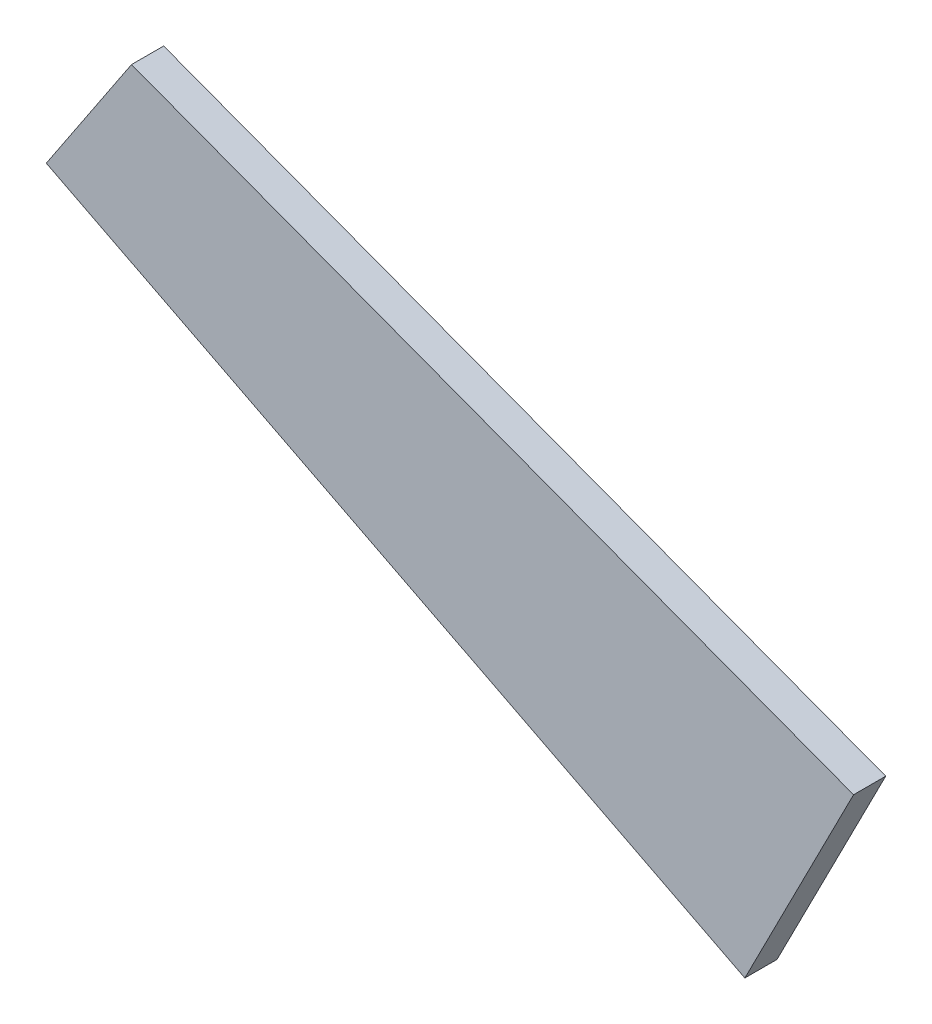
ISO-10303-21;
HEADER;
FILE_DESCRIPTION(('STEP AP214'),'2;1');
FILE_NAME('part.step','',(''),(''),'','','');
FILE_SCHEMA(('AUTOMOTIVE_DESIGN { 1 0 10303 214 1 1 1 1 }'));
ENDSEC;
DATA;
#1=APPLICATION_CONTEXT('core data for automotive mechanical design processes');
#2=APPLICATION_PROTOCOL_DEFINITION('international standard','automotive_design',2000,#1);
#3=PRODUCT_CONTEXT('',#1,'mechanical');
#4=PRODUCT('Part','Part','',(#3));
#5=PRODUCT_RELATED_PRODUCT_CATEGORY('part','',(#4));
#6=PRODUCT_DEFINITION_FORMATION('','',#4);
#7=PRODUCT_DEFINITION_CONTEXT('part definition',#1,'design');
#8=PRODUCT_DEFINITION('design','',#6,#7);
#9=PRODUCT_DEFINITION_SHAPE('','',#8);
#10=(LENGTH_UNIT() NAMED_UNIT(*) SI_UNIT(.MILLI.,.METRE.));
#11=(NAMED_UNIT(*) PLANE_ANGLE_UNIT() SI_UNIT($,.RADIAN.));
#12=(NAMED_UNIT(*) SI_UNIT($,.STERADIAN.) SOLID_ANGLE_UNIT());
#13=UNCERTAINTY_MEASURE_WITH_UNIT(LENGTH_MEASURE(1.E-05),#10,'distance_accuracy_value','');
#14=(GEOMETRIC_REPRESENTATION_CONTEXT(3) GLOBAL_UNCERTAINTY_ASSIGNED_CONTEXT((#13)) GLOBAL_UNIT_ASSIGNED_CONTEXT((#10,
#11,#12)) REPRESENTATION_CONTEXT('',''));
#15=CARTESIAN_POINT('',(0.,0.,0.));
#16=DIRECTION('',(0.,0.,1.));
#17=DIRECTION('',(1.,0.,0.));
#18=AXIS2_PLACEMENT_3D('',#15,#16,#17);
#19=CARTESIAN_POINT('',(316.89223359619,53.3320040135206,2.54));
#20=DIRECTION('',(-0.351768610150847,-0.936086985761762,0.));
#21=DIRECTION('',(0.936086985761762,-0.351768610150847,0.));
#22=AXIS2_PLACEMENT_3D('',#19,#20,#21);
#23=PLANE('',#22);
#24=DIRECTION('',(-0.936086985761762,0.351768610150847,0.));
#25=VECTOR('',#24,1.);
#26=CARTESIAN_POINT('',(316.89223359619,53.3320040135206,0.));
#27=LINE('',#26,#25);
#28=CARTESIAN_POINT('',(316.89223359619,53.3320040135206,0.));
#29=VERTEX_POINT('',#28);
#30=CARTESIAN_POINT('',(259.808460711214,74.783300479921,0.));
#31=VERTEX_POINT('',#30);
#32=EDGE_CURVE('E95',#29,#31,#27,.T.);
#33=ORIENTED_EDGE('',*,*,#32,.T.);
#34=DIRECTION('',(0.,0.,-1.));
#35=VECTOR('',#34,1.);
#36=CARTESIAN_POINT('',(259.808460711214,74.783300479921,2.54));
#37=LINE('',#36,#35);
#38=CARTESIAN_POINT('',(259.808460711214,74.783300479921,2.54));
#39=VERTEX_POINT('',#38);
#40=EDGE_CURVE('E11',#39,#31,#37,.T.);
#41=ORIENTED_EDGE('',*,*,#40,.F.);
#42=DIRECTION('',(-0.936086985761762,0.351768610150847,0.));
#43=VECTOR('',#42,1.);
#44=CARTESIAN_POINT('',(316.89223359619,53.3320040135206,2.54));
#45=LINE('',#44,#43);
#46=CARTESIAN_POINT('',(316.89223359619,53.3320040135206,2.54));
#47=VERTEX_POINT('',#46);
#48=EDGE_CURVE('E83',#47,#39,#45,.T.);
#49=ORIENTED_EDGE('',*,*,#48,.F.);
#50=DIRECTION('',(0.,0.,-1.));
#51=VECTOR('',#50,1.);
#52=CARTESIAN_POINT('',(316.89223359619,53.3320040135206,2.54));
#53=LINE('',#52,#51);
#54=EDGE_CURVE('E91',#47,#29,#53,.T.);
#55=ORIENTED_EDGE('',*,*,#54,.T.);
#56=EDGE_LOOP('',(#33,#41,#49,#55));
#57=FACE_BOUND('',#56,.T.);
#58=ADVANCED_FACE('F32',(#57),#23,.F.);
#59=CARTESIAN_POINT('',(259.808460711214,74.783300479921,2.54));
#60=DIRECTION('',(0.83241653962444,-0.55415043495397,0.));
#61=DIRECTION('',(0.55415043495397,0.832416539624439,0.));
#62=AXIS2_PLACEMENT_3D('',#59,#60,#61);
#63=PLANE('',#62);
#64=DIRECTION('',(-0.55415043495397,-0.832416539624439,0.));
#65=VECTOR('',#64,1.);
#66=CARTESIAN_POINT('',(259.808460711214,74.783300479921,0.));
#67=LINE('',#66,#65);
#68=CARTESIAN_POINT('',(253.071131884169,64.6628285019704,0.));
#69=VERTEX_POINT('',#68);
#70=EDGE_CURVE('E87',#31,#69,#67,.T.);
#71=ORIENTED_EDGE('',*,*,#70,.T.);
#72=DIRECTION('',(0.,0.,-1.));
#73=VECTOR('',#72,1.);
#74=CARTESIAN_POINT('',(253.071131884169,64.6628285019704,2.54));
#75=LINE('',#74,#73);
#76=CARTESIAN_POINT('',(253.071131884169,64.6628285019704,2.54));
#77=VERTEX_POINT('',#76);
#78=EDGE_CURVE('E40',#77,#69,#75,.T.);
#79=ORIENTED_EDGE('',*,*,#78,.F.);
#80=DIRECTION('',(-0.55415043495397,-0.832416539624439,0.));
#81=VECTOR('',#80,1.);
#82=CARTESIAN_POINT('',(259.808460711214,74.783300479921,2.54));
#83=LINE('',#82,#81);
#84=EDGE_CURVE('E78',#39,#77,#83,.T.);
#85=ORIENTED_EDGE('',*,*,#84,.F.);
#86=ORIENTED_EDGE('',*,*,#40,.T.);
#87=EDGE_LOOP('',(#71,#79,#85,#86));
#88=FACE_BOUND('',#87,.T.);
#89=ADVANCED_FACE('F86',(#88),#63,.F.);
#90=CARTESIAN_POINT('',(253.071131884169,64.6628285019704,2.54));
#91=DIRECTION('',(0.454428877761693,0.890783023556381,0.));
#92=DIRECTION('',(-0.890783023556381,0.454428877761693,0.));
#93=AXIS2_PLACEMENT_3D('',#90,#91,#92);
#94=PLANE('',#93);
#95=DIRECTION('',(0.890783023556381,-0.454428877761693,0.));
#96=VECTOR('',#95,1.);
#97=CARTESIAN_POINT('',(253.071131884169,64.6628285019704,0.));
#98=LINE('',#97,#96);
#99=CARTESIAN_POINT('',(308.299508141632,36.488325419188,0.));
#100=VERTEX_POINT('',#99);
#101=EDGE_CURVE('E65',#69,#100,#98,.T.);
#102=ORIENTED_EDGE('',*,*,#101,.T.);
#103=DIRECTION('',(0.,0.,-1.));
#104=VECTOR('',#103,1.);
#105=CARTESIAN_POINT('',(308.299508141632,36.488325419188,2.54));
#106=LINE('',#105,#104);
#107=CARTESIAN_POINT('',(308.299508141632,36.488325419188,2.54));
#108=VERTEX_POINT('',#107);
#109=EDGE_CURVE('E88',#108,#100,#106,.T.);
#110=ORIENTED_EDGE('',*,*,#109,.F.);
#111=DIRECTION('',(0.890783023556381,-0.454428877761693,0.));
#112=VECTOR('',#111,1.);
#113=CARTESIAN_POINT('',(253.071131884169,64.6628285019704,2.54));
#114=LINE('',#113,#112);
#115=EDGE_CURVE('E81',#77,#108,#114,.T.);
#116=ORIENTED_EDGE('',*,*,#115,.F.);
#117=ORIENTED_EDGE('',*,*,#78,.T.);
#118=EDGE_LOOP('',(#102,#110,#116,#117));
#119=FACE_BOUND('',#118,.T.);
#120=ADVANCED_FACE('F89',(#119),#94,.F.);
#121=CARTESIAN_POINT('',(308.299508141632,36.488325419188,2.54));
#122=DIRECTION('',(-0.890783023556381,0.454428877761694,0.));
#123=DIRECTION('',(-0.454428877761694,-0.890783023556381,0.));
#124=AXIS2_PLACEMENT_3D('',#121,#122,#123);
#125=PLANE('',#124);
#126=DIRECTION('',(0.454428877761694,0.890783023556381,0.));
#127=VECTOR('',#126,1.);
#128=CARTESIAN_POINT('',(308.299508141632,36.488325419188,0.));
#129=LINE('',#128,#127);
#130=EDGE_CURVE('E71',#100,#29,#129,.T.);
#131=ORIENTED_EDGE('',*,*,#130,.T.);
#132=ORIENTED_EDGE('',*,*,#54,.F.);
#133=DIRECTION('',(0.454428877761694,0.890783023556381,0.));
#134=VECTOR('',#133,1.);
#135=CARTESIAN_POINT('',(308.299508141632,36.488325419188,2.54));
#136=LINE('',#135,#134);
#137=EDGE_CURVE('E48',#108,#47,#136,.T.);
#138=ORIENTED_EDGE('',*,*,#137,.F.);
#139=ORIENTED_EDGE('',*,*,#109,.T.);
#140=EDGE_LOOP('',(#131,#132,#138,#139));
#141=FACE_BOUND('',#140,.T.);
#142=ADVANCED_FACE('F102',(#141),#125,.F.);
#143=CARTESIAN_POINT('',(316.89223359619,53.3320040135206,2.54));
#144=DIRECTION('',(0.,0.,-1.));
#145=DIRECTION('',(-1.,0.,0.));
#146=AXIS2_PLACEMENT_3D('',#143,#144,#145);
#147=PLANE('',#146);
#148=ORIENTED_EDGE('',*,*,#48,.T.);
#149=ORIENTED_EDGE('',*,*,#84,.T.);
#150=ORIENTED_EDGE('',*,*,#115,.T.);
#151=ORIENTED_EDGE('',*,*,#137,.T.);
#152=EDGE_LOOP('',(#148,#149,#150,#151));
#153=FACE_BOUND('',#152,.T.);
#154=ADVANCED_FACE('F79',(#153),#147,.F.);
#155=CARTESIAN_POINT('',(316.89223359619,53.3320040135206,0.));
#156=DIRECTION('',(0.,0.,-1.));
#157=DIRECTION('',(-1.,0.,0.));
#158=AXIS2_PLACEMENT_3D('',#155,#156,#157);
#159=PLANE('',#158);
#160=ORIENTED_EDGE('',*,*,#32,.F.);
#161=ORIENTED_EDGE('',*,*,#130,.F.);
#162=ORIENTED_EDGE('',*,*,#101,.F.);
#163=ORIENTED_EDGE('',*,*,#70,.F.);
#164=EDGE_LOOP('',(#160,#161,#162,#163));
#165=FACE_BOUND('',#164,.T.);
#166=ADVANCED_FACE('F105',(#165),#159,.T.);
#167=CLOSED_SHELL('',(#58,#89,#120,#142,#154,#166));
#168=MANIFOLD_SOLID_BREP('B2',#167);
#169=ADVANCED_BREP_SHAPE_REPRESENTATION('',(#18,#168),#14);
#170=SHAPE_DEFINITION_REPRESENTATION(#9,#169);
ENDSEC;
END-ISO-10303-21;
